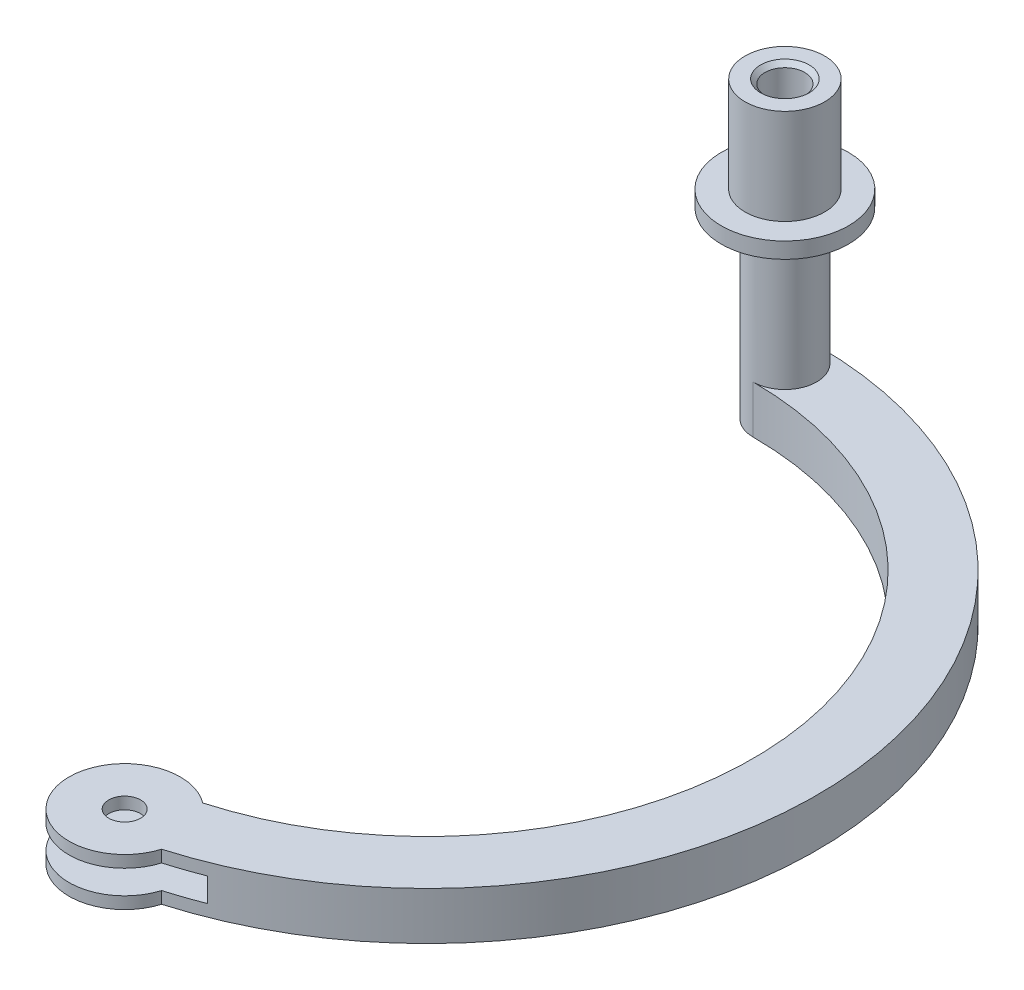
ISO-10303-21;
HEADER;
FILE_DESCRIPTION(('STEP AP214'),'2;1');
FILE_NAME('part.step','',(''),(''),'','','');
FILE_SCHEMA(('AUTOMOTIVE_DESIGN { 1 0 10303 214 1 1 1 1 }'));
ENDSEC;
DATA;
#1=APPLICATION_CONTEXT('core data for automotive mechanical design processes');
#2=APPLICATION_PROTOCOL_DEFINITION('international standard','automotive_design',2000,#1);
#3=PRODUCT_CONTEXT('',#1,'mechanical');
#4=PRODUCT('Part','Part','',(#3));
#5=PRODUCT_RELATED_PRODUCT_CATEGORY('part','',(#4));
#6=PRODUCT_DEFINITION_FORMATION('','',#4);
#7=PRODUCT_DEFINITION_CONTEXT('part definition',#1,'design');
#8=PRODUCT_DEFINITION('design','',#6,#7);
#9=PRODUCT_DEFINITION_SHAPE('','',#8);
#10=(LENGTH_UNIT() NAMED_UNIT(*) SI_UNIT(.MILLI.,.METRE.));
#11=(NAMED_UNIT(*) PLANE_ANGLE_UNIT() SI_UNIT($,.RADIAN.));
#12=(NAMED_UNIT(*) SI_UNIT($,.STERADIAN.) SOLID_ANGLE_UNIT());
#13=UNCERTAINTY_MEASURE_WITH_UNIT(LENGTH_MEASURE(1.E-05),#10,'distance_accuracy_value','');
#14=(GEOMETRIC_REPRESENTATION_CONTEXT(3) GLOBAL_UNCERTAINTY_ASSIGNED_CONTEXT((#13)) GLOBAL_UNIT_ASSIGNED_CONTEXT((#10,
#11,#12)) REPRESENTATION_CONTEXT('',''));
#15=CARTESIAN_POINT('',(0.,0.,0.));
#16=DIRECTION('',(0.,0.,1.));
#17=DIRECTION('',(1.,0.,0.));
#18=AXIS2_PLACEMENT_3D('',#15,#16,#17);
#19=CARTESIAN_POINT('',(0.,-12.5,22.5));
#20=DIRECTION('',(0.,1.,0.));
#21=DIRECTION('',(0.,0.,1.));
#22=AXIS2_PLACEMENT_3D('',#19,#20,#21);
#23=CYLINDRICAL_SURFACE('',#22,20.5);
#24=CARTESIAN_POINT('',(0.,-11.75,22.5));
#25=DIRECTION('',(0.,1.,0.));
#26=DIRECTION('',(0.,0.,1.));
#27=AXIS2_PLACEMENT_3D('',#24,#25,#26);
#28=CIRCLE('',#27,20.5);
#29=CARTESIAN_POINT('',(7.73125882983083,-11.75,41.4862486264708));
#30=VERTEX_POINT('',#29);
#31=CARTESIAN_POINT('',(5.61951395352331,-11.75,42.2147422738964));
#32=VERTEX_POINT('',#31);
#33=EDGE_CURVE('E155',#30,#32,#28,.F.);
#34=ORIENTED_EDGE('',*,*,#33,.F.);
#35=DIRECTION('',(0.,1.,0.));
#36=VECTOR('',#35,1.);
#37=CARTESIAN_POINT('',(7.73125882983082,-11.,41.4862486264708));
#38=LINE('',#37,#36);
#39=CARTESIAN_POINT('',(7.73125882983083,-10.25,41.4862486264708));
#40=VERTEX_POINT('',#39);
#41=EDGE_CURVE('E151',#30,#40,#38,.T.);
#42=ORIENTED_EDGE('',*,*,#41,.T.);
#43=CARTESIAN_POINT('',(0.,-10.25,22.5));
#44=DIRECTION('',(0.,1.,0.));
#45=DIRECTION('',(0.,0.,1.));
#46=AXIS2_PLACEMENT_3D('',#43,#44,#45);
#47=CIRCLE('',#46,20.5);
#48=CARTESIAN_POINT('',(5.61951395352331,-10.25,42.2147422738964));
#49=VERTEX_POINT('',#48);
#50=EDGE_CURVE('E150',#40,#49,#47,.F.);
#51=ORIENTED_EDGE('',*,*,#50,.T.);
#52=DIRECTION('',(0.,1.,0.));
#53=VECTOR('',#52,1.);
#54=CARTESIAN_POINT('',(5.61951395352331,-12.5,42.2147422738964));
#55=LINE('',#54,#53);
#56=CARTESIAN_POINT('',(5.61951395352331,-9.5,42.2147422738964));
#57=VERTEX_POINT('',#56);
#58=EDGE_CURVE('E166',#49,#57,#55,.T.);
#59=ORIENTED_EDGE('',*,*,#58,.T.);
#60=CARTESIAN_POINT('',(0.,-9.5,22.5));
#61=DIRECTION('',(0.,1.,0.));
#62=DIRECTION('',(0.,0.,-1.));
#63=AXIS2_PLACEMENT_3D('',#60,#61,#62);
#64=CIRCLE('',#63,20.5);
#65=CARTESIAN_POINT('',(0.,-9.5,2.));
#66=VERTEX_POINT('',#65);
#67=EDGE_CURVE('E160',#57,#66,#64,.T.);
#68=ORIENTED_EDGE('',*,*,#67,.T.);
#69=DIRECTION('',(0.,1.,0.));
#70=VECTOR('',#69,1.);
#71=CARTESIAN_POINT('',(0.,-12.5,2.));
#72=LINE('',#71,#70);
#73=CARTESIAN_POINT('',(0.,-12.5,2.));
#74=VERTEX_POINT('',#73);
#75=EDGE_CURVE('E187',#74,#66,#72,.T.);
#76=ORIENTED_EDGE('',*,*,#75,.F.);
#77=CARTESIAN_POINT('',(0.,-12.5,22.5));
#78=DIRECTION('',(0.,1.,0.));
#79=DIRECTION('',(0.,0.,-1.));
#80=AXIS2_PLACEMENT_3D('',#77,#78,#79);
#81=CIRCLE('',#80,20.5);
#82=CARTESIAN_POINT('',(5.61951395352331,-12.5,42.2147422738964));
#83=VERTEX_POINT('',#82);
#84=EDGE_CURVE('E156',#83,#74,#81,.T.);
#85=ORIENTED_EDGE('',*,*,#84,.F.);
#86=EDGE_CURVE('E176',#83,#32,#55,.T.);
#87=ORIENTED_EDGE('',*,*,#86,.T.);
#88=EDGE_LOOP('',(#34,#42,#51,#59,#68,#76,#85,#87));
#89=FACE_BOUND('',#88,.T.);
#90=ADVANCED_FACE('F44',(#89),#23,.F.);
#91=CARTESIAN_POINT('',(0.,-12.5,22.5));
#92=DIRECTION('',(0.,1.,0.));
#93=DIRECTION('',(0.,0.,1.));
#94=AXIS2_PLACEMENT_3D('',#91,#92,#93);
#95=CYLINDRICAL_SURFACE('',#94,24.5);
#96=CARTESIAN_POINT('',(0.,-11.75,22.5));
#97=DIRECTION('',(0.,1.,0.));
#98=DIRECTION('',(0.,0.,1.));
#99=AXIS2_PLACEMENT_3D('',#96,#97,#98);
#100=CIRCLE('',#99,24.5);
#101=CARTESIAN_POINT('',(6.84690974045204,-11.75,46.0238140403741));
#102=VERTEX_POINT('',#101);
#103=CARTESIAN_POINT('',(8.99234501725297,-11.75,45.2900796639829));
#104=VERTEX_POINT('',#103);
#105=EDGE_CURVE('E148',#102,#104,#100,.T.);
#106=ORIENTED_EDGE('',*,*,#105,.F.);
#107=DIRECTION('',(0.,1.,0.));
#108=VECTOR('',#107,1.);
#109=CARTESIAN_POINT('',(6.84690974045204,-12.5,46.0238140403741));
#110=LINE('',#109,#108);
#111=CARTESIAN_POINT('',(6.84690974045204,-12.5,46.0238140403741));
#112=VERTEX_POINT('',#111);
#113=EDGE_CURVE('E179',#112,#102,#110,.T.);
#114=ORIENTED_EDGE('',*,*,#113,.F.);
#115=CARTESIAN_POINT('',(0.,-12.5,22.5));
#116=DIRECTION('',(0.,-1.,0.));
#117=DIRECTION('',(0.,0.,1.));
#118=AXIS2_PLACEMENT_3D('',#115,#116,#117);
#119=CIRCLE('',#118,24.5);
#120=CARTESIAN_POINT('',(0.,-12.5,-2.));
#121=VERTEX_POINT('',#120);
#122=EDGE_CURVE('E165',#121,#112,#119,.T.);
#123=ORIENTED_EDGE('',*,*,#122,.F.);
#124=DIRECTION('',(0.,1.,0.));
#125=VECTOR('',#124,1.);
#126=CARTESIAN_POINT('',(0.,-12.5,-2.));
#127=LINE('',#126,#125);
#128=CARTESIAN_POINT('',(0.,-9.5,-2.));
#129=VERTEX_POINT('',#128);
#130=EDGE_CURVE('E182',#121,#129,#127,.T.);
#131=ORIENTED_EDGE('',*,*,#130,.T.);
#132=CARTESIAN_POINT('',(0.,-9.5,22.5));
#133=DIRECTION('',(0.,-1.,0.));
#134=DIRECTION('',(0.,0.,1.));
#135=AXIS2_PLACEMENT_3D('',#132,#133,#134);
#136=CIRCLE('',#135,24.5);
#137=CARTESIAN_POINT('',(6.84690974045204,-9.5,46.0238140403741));
#138=VERTEX_POINT('',#137);
#139=EDGE_CURVE('E171',#129,#138,#136,.T.);
#140=ORIENTED_EDGE('',*,*,#139,.T.);
#141=CARTESIAN_POINT('',(6.84690974045204,-10.25,46.0238140403741));
#142=VERTEX_POINT('',#141);
#143=EDGE_CURVE('E177',#142,#138,#110,.T.);
#144=ORIENTED_EDGE('',*,*,#143,.F.);
#145=CARTESIAN_POINT('',(0.,-10.25,22.5));
#146=DIRECTION('',(0.,1.,0.));
#147=DIRECTION('',(0.,0.,1.));
#148=AXIS2_PLACEMENT_3D('',#145,#146,#147);
#149=CIRCLE('',#148,24.5);
#150=CARTESIAN_POINT('',(8.99234501725297,-10.25,45.2900796639829));
#151=VERTEX_POINT('',#150);
#152=EDGE_CURVE('E62',#142,#151,#149,.T.);
#153=ORIENTED_EDGE('',*,*,#152,.T.);
#154=DIRECTION('',(0.,1.,0.));
#155=VECTOR('',#154,1.);
#156=CARTESIAN_POINT('',(8.99234501725297,-11.,45.2900796639829));
#157=LINE('',#156,#155);
#158=EDGE_CURVE('E11',#151,#104,#157,.F.);
#159=ORIENTED_EDGE('',*,*,#158,.T.);
#160=EDGE_LOOP('',(#106,#114,#123,#131,#140,#144,#153,#159));
#161=FACE_BOUND('',#160,.T.);
#162=ADVANCED_FACE('F217',(#161),#95,.T.);
#163=CARTESIAN_POINT('',(3.49999999999999,-12.5,45.));
#164=DIRECTION('',(0.,1.,0.));
#165=DIRECTION('',(0.,0.,1.));
#166=AXIS2_PLACEMENT_3D('',#163,#164,#165);
#167=CYLINDRICAL_SURFACE('',#166,3.5);
#168=CARTESIAN_POINT('',(3.49999999999999,-11.75,45.));
#169=DIRECTION('',(0.,1.,0.));
#170=DIRECTION('',(0.,0.,1.));
#171=AXIS2_PLACEMENT_3D('',#168,#169,#170);
#172=CIRCLE('',#171,3.5);
#173=EDGE_CURVE('E53',#32,#102,#172,.T.);
#174=ORIENTED_EDGE('',*,*,#173,.F.);
#175=ORIENTED_EDGE('',*,*,#86,.F.);
#176=CARTESIAN_POINT('',(3.49999999999999,-12.5,45.));
#177=DIRECTION('',(0.,-1.,0.));
#178=DIRECTION('',(0.,0.,1.));
#179=AXIS2_PLACEMENT_3D('',#176,#177,#178);
#180=CIRCLE('',#179,3.5);
#181=EDGE_CURVE('E168',#112,#83,#180,.T.);
#182=ORIENTED_EDGE('',*,*,#181,.F.);
#183=ORIENTED_EDGE('',*,*,#113,.T.);
#184=EDGE_LOOP('',(#174,#175,#182,#183));
#185=FACE_BOUND('',#184,.T.);
#186=ADVANCED_FACE('F216',(#185),#167,.T.);
#187=CARTESIAN_POINT('',(0.,6.,0.));
#188=DIRECTION('',(0.,-1.,0.));
#189=DIRECTION('',(0.,0.,-1.));
#190=AXIS2_PLACEMENT_3D('',#187,#188,#189);
#191=CYLINDRICAL_SURFACE('',#190,2.5);
#192=CARTESIAN_POINT('',(0.,6.,0.));
#193=DIRECTION('',(0.,1.,0.));
#194=DIRECTION('',(0.,0.,1.));
#195=AXIS2_PLACEMENT_3D('',#192,#193,#194);
#196=CIRCLE('',#195,2.5);
#197=CARTESIAN_POINT('',(0.,6.,2.5));
#198=VERTEX_POINT('',#197);
#199=EDGE_CURVE('E195',#198,#198,#196,.T.);
#200=ORIENTED_EDGE('',*,*,#199,.F.);
#201=EDGE_LOOP('',(#200));
#202=FACE_BOUND('',#201,.T.);
#203=CARTESIAN_POINT('',(0.,0.,0.));
#204=DIRECTION('',(0.,1.,0.));
#205=DIRECTION('',(0.,0.,1.));
#206=AXIS2_PLACEMENT_3D('',#203,#204,#205);
#207=CIRCLE('',#206,2.5);
#208=CARTESIAN_POINT('',(0.,0.,2.5));
#209=VERTEX_POINT('',#208);
#210=EDGE_CURVE('E199',#209,#209,#207,.T.);
#211=ORIENTED_EDGE('',*,*,#210,.T.);
#212=EDGE_LOOP('',(#211));
#213=FACE_BOUND('',#212,.T.);
#214=ADVANCED_FACE('F50',(#202,#213),#191,.T.);
#215=CARTESIAN_POINT('',(0.,6.,0.));
#216=DIRECTION('',(0.,1.,0.));
#217=DIRECTION('',(0.,0.,1.));
#218=AXIS2_PLACEMENT_3D('',#215,#216,#217);
#219=PLANE('',#218);
#220=CARTESIAN_POINT('',(0.,6.,0.));
#221=DIRECTION('',(0.,1.,0.));
#222=DIRECTION('',(0.,0.,1.));
#223=AXIS2_PLACEMENT_3D('',#220,#221,#222);
#224=CIRCLE('',#223,1.525);
#225=CARTESIAN_POINT('',(0.,6.,1.525));
#226=VERTEX_POINT('',#225);
#227=EDGE_CURVE('E132',#226,#226,#224,.T.);
#228=ORIENTED_EDGE('',*,*,#227,.F.);
#229=EDGE_LOOP('',(#228));
#230=FACE_BOUND('',#229,.T.);
#231=ORIENTED_EDGE('',*,*,#199,.T.);
#232=EDGE_LOOP('',(#231));
#233=FACE_BOUND('',#232,.T.);
#234=ADVANCED_FACE('F275',(#230,#233),#219,.T.);
#235=CARTESIAN_POINT('',(0.,-1.,0.));
#236=DIRECTION('',(0.,1.,0.));
#237=DIRECTION('',(0.,0.,1.));
#238=AXIS2_PLACEMENT_3D('',#235,#236,#237);
#239=CYLINDRICAL_SURFACE('',#238,4.);
#240=CARTESIAN_POINT('',(0.,-1.,0.));
#241=DIRECTION('',(0.,-1.,0.));
#242=DIRECTION('',(0.,0.,-1.));
#243=AXIS2_PLACEMENT_3D('',#240,#241,#242);
#244=CIRCLE('',#243,4.);
#245=CARTESIAN_POINT('',(0.,-1.,-4.));
#246=VERTEX_POINT('',#245);
#247=EDGE_CURVE('E193',#246,#246,#244,.T.);
#248=ORIENTED_EDGE('',*,*,#247,.F.);
#249=EDGE_LOOP('',(#248));
#250=FACE_BOUND('',#249,.T.);
#251=CARTESIAN_POINT('',(0.,0.,0.));
#252=DIRECTION('',(0.,-1.,0.));
#253=DIRECTION('',(0.,0.,-1.));
#254=AXIS2_PLACEMENT_3D('',#251,#252,#253);
#255=CIRCLE('',#254,4.);
#256=CARTESIAN_POINT('',(0.,0.,-4.));
#257=VERTEX_POINT('',#256);
#258=EDGE_CURVE('E191',#257,#257,#255,.T.);
#259=ORIENTED_EDGE('',*,*,#258,.T.);
#260=EDGE_LOOP('',(#259));
#261=FACE_BOUND('',#260,.T.);
#262=ADVANCED_FACE('F268',(#250,#261),#239,.T.);
#263=CARTESIAN_POINT('',(0.,-1.,0.));
#264=DIRECTION('',(0.,-1.,0.));
#265=DIRECTION('',(0.,0.,-1.));
#266=AXIS2_PLACEMENT_3D('',#263,#264,#265);
#267=PLANE('',#266);
#268=CARTESIAN_POINT('',(0.,-1.,0.));
#269=DIRECTION('',(0.,-1.,0.));
#270=DIRECTION('',(0.,0.,-1.));
#271=AXIS2_PLACEMENT_3D('',#268,#269,#270);
#272=CIRCLE('',#271,2.);
#273=CARTESIAN_POINT('',(0.,-1.,-2.));
#274=VERTEX_POINT('',#273);
#275=EDGE_CURVE('E189',#274,#274,#272,.T.);
#276=ORIENTED_EDGE('',*,*,#275,.F.);
#277=EDGE_LOOP('',(#276));
#278=FACE_BOUND('',#277,.T.);
#279=ORIENTED_EDGE('',*,*,#247,.T.);
#280=EDGE_LOOP('',(#279));
#281=FACE_BOUND('',#280,.T.);
#282=ADVANCED_FACE('F264',(#278,#281),#267,.T.);
#283=CARTESIAN_POINT('',(0.,0.,0.));
#284=DIRECTION('',(0.,-1.,0.));
#285=DIRECTION('',(0.,0.,-1.));
#286=AXIS2_PLACEMENT_3D('',#283,#284,#285);
#287=PLANE('',#286);
#288=ORIENTED_EDGE('',*,*,#210,.F.);
#289=EDGE_LOOP('',(#288));
#290=FACE_BOUND('',#289,.T.);
#291=ORIENTED_EDGE('',*,*,#258,.F.);
#292=EDGE_LOOP('',(#291));
#293=FACE_BOUND('',#292,.T.);
#294=ADVANCED_FACE('F262',(#290,#293),#287,.F.);
#295=CARTESIAN_POINT('',(0.,-15.1568542494924,0.));
#296=DIRECTION('',(0.,1.,0.));
#297=DIRECTION('',(0.,0.,1.));
#298=AXIS2_PLACEMENT_3D('',#295,#296,#297);
#299=CYLINDRICAL_SURFACE('',#298,2.);
#300=ORIENTED_EDGE('',*,*,#275,.T.);
#301=EDGE_LOOP('',(#300));
#302=FACE_BOUND('',#301,.T.);
#303=CARTESIAN_POINT('',(0.,-9.5,0.));
#304=DIRECTION('',(0.,-1.,0.));
#305=DIRECTION('',(0.,0.,-1.));
#306=AXIS2_PLACEMENT_3D('',#303,#304,#305);
#307=CIRCLE('',#306,2.);
#308=EDGE_CURVE('E66',#129,#66,#307,.T.);
#309=ORIENTED_EDGE('',*,*,#308,.F.);
#310=ORIENTED_EDGE('',*,*,#130,.F.);
#311=CARTESIAN_POINT('',(0.,-12.5,0.));
#312=DIRECTION('',(0.,-1.,0.));
#313=DIRECTION('',(0.,0.,1.));
#314=AXIS2_PLACEMENT_3D('',#311,#312,#313);
#315=CIRCLE('',#314,2.);
#316=EDGE_CURVE('E163',#74,#121,#315,.T.);
#317=ORIENTED_EDGE('',*,*,#316,.F.);
#318=ORIENTED_EDGE('',*,*,#75,.T.);
#319=EDGE_LOOP('',(#309,#310,#317,#318));
#320=FACE_BOUND('',#319,.T.);
#321=ADVANCED_FACE('F256',(#302,#320),#299,.T.);
#322=ORIENTED_EDGE('',*,*,#58,.F.);
#323=CARTESIAN_POINT('',(3.49999999999999,-10.25,45.));
#324=DIRECTION('',(0.,1.,0.));
#325=DIRECTION('',(0.,0.,1.));
#326=AXIS2_PLACEMENT_3D('',#323,#324,#325);
#327=CIRCLE('',#326,3.5);
#328=EDGE_CURVE('E192',#49,#142,#327,.T.);
#329=ORIENTED_EDGE('',*,*,#328,.T.);
#330=ORIENTED_EDGE('',*,*,#143,.T.);
#331=CARTESIAN_POINT('',(3.49999999999999,-9.5,45.));
#332=DIRECTION('',(0.,-1.,0.));
#333=DIRECTION('',(0.,0.,1.));
#334=AXIS2_PLACEMENT_3D('',#331,#332,#333);
#335=CIRCLE('',#334,3.5);
#336=EDGE_CURVE('E162',#138,#57,#335,.T.);
#337=ORIENTED_EDGE('',*,*,#336,.T.);
#338=EDGE_LOOP('',(#322,#329,#330,#337));
#339=FACE_BOUND('',#338,.T.);
#340=ADVANCED_FACE('F233',(#339),#167,.T.);
#341=CARTESIAN_POINT('',(1.75,-12.5,33.75));
#342=DIRECTION('',(0.,-1.,0.));
#343=DIRECTION('',(0.,0.,-1.));
#344=AXIS2_PLACEMENT_3D('',#341,#342,#343);
#345=PLANE('',#344);
#346=CARTESIAN_POINT('',(3.49999999999999,-12.5,45.));
#347=DIRECTION('',(0.,1.,0.));
#348=DIRECTION('',(0.,0.,1.));
#349=AXIS2_PLACEMENT_3D('',#346,#347,#348);
#350=CIRCLE('',#349,1.);
#351=CARTESIAN_POINT('',(3.49999999999999,-12.5,46.));
#352=VERTEX_POINT('',#351);
#353=EDGE_CURVE('E129',#352,#352,#350,.T.);
#354=ORIENTED_EDGE('',*,*,#353,.T.);
#355=EDGE_LOOP('',(#354));
#356=FACE_BOUND('',#355,.T.);
#357=ORIENTED_EDGE('',*,*,#84,.T.);
#358=ORIENTED_EDGE('',*,*,#316,.T.);
#359=ORIENTED_EDGE('',*,*,#122,.T.);
#360=ORIENTED_EDGE('',*,*,#181,.T.);
#361=EDGE_LOOP('',(#357,#358,#359,#360));
#362=FACE_BOUND('',#361,.T.);
#363=ADVANCED_FACE('F225',(#356,#362),#345,.T.);
#364=CARTESIAN_POINT('',(1.75,-9.5,33.75));
#365=DIRECTION('',(0.,-1.,0.));
#366=DIRECTION('',(0.,0.,-1.));
#367=AXIS2_PLACEMENT_3D('',#364,#365,#366);
#368=PLANE('',#367);
#369=CARTESIAN_POINT('',(3.49999999999999,-9.5,45.));
#370=DIRECTION('',(0.,1.,0.));
#371=DIRECTION('',(0.,0.,1.));
#372=AXIS2_PLACEMENT_3D('',#369,#370,#371);
#373=CIRCLE('',#372,1.);
#374=CARTESIAN_POINT('',(3.49999999999999,-9.5,46.));
#375=VERTEX_POINT('',#374);
#376=EDGE_CURVE('E121',#375,#375,#373,.T.);
#377=ORIENTED_EDGE('',*,*,#376,.F.);
#378=EDGE_LOOP('',(#377));
#379=FACE_BOUND('',#378,.T.);
#380=ORIENTED_EDGE('',*,*,#139,.F.);
#381=ORIENTED_EDGE('',*,*,#308,.T.);
#382=ORIENTED_EDGE('',*,*,#67,.F.);
#383=ORIENTED_EDGE('',*,*,#336,.F.);
#384=EDGE_LOOP('',(#380,#381,#382,#383));
#385=FACE_BOUND('',#384,.T.);
#386=ADVANCED_FACE('F226',(#379,#385),#368,.F.);
#387=CARTESIAN_POINT('',(3.49999999999999,-11.75,45.));
#388=DIRECTION('',(0.,1.,0.));
#389=DIRECTION('',(0.,0.,1.));
#390=AXIS2_PLACEMENT_3D('',#387,#388,#389);
#391=CYLINDRICAL_SURFACE('',#390,5.5);
#392=CARTESIAN_POINT('',(3.49999999999999,-11.75,45.));
#393=DIRECTION('',(0.,1.,0.));
#394=DIRECTION('',(0.,0.,1.));
#395=AXIS2_PLACEMENT_3D('',#392,#393,#394);
#396=CIRCLE('',#395,5.5);
#397=EDGE_CURVE('E142',#104,#30,#396,.T.);
#398=ORIENTED_EDGE('',*,*,#397,.F.);
#399=ORIENTED_EDGE('',*,*,#158,.F.);
#400=CARTESIAN_POINT('',(3.49999999999999,-10.25,45.));
#401=DIRECTION('',(0.,1.,0.));
#402=DIRECTION('',(0.,0.,1.));
#403=AXIS2_PLACEMENT_3D('',#400,#401,#402);
#404=CIRCLE('',#403,5.5);
#405=EDGE_CURVE('E137',#151,#40,#404,.T.);
#406=ORIENTED_EDGE('',*,*,#405,.T.);
#407=ORIENTED_EDGE('',*,*,#41,.F.);
#408=EDGE_LOOP('',(#398,#399,#406,#407));
#409=FACE_BOUND('',#408,.T.);
#410=ADVANCED_FACE('F232',(#409),#391,.F.);
#411=CARTESIAN_POINT('',(3.49999999999999,-11.75,45.));
#412=DIRECTION('',(0.,1.,0.));
#413=DIRECTION('',(0.,0.,1.));
#414=AXIS2_PLACEMENT_3D('',#411,#412,#413);
#415=PLANE('',#414);
#416=CARTESIAN_POINT('',(3.49999999999999,-11.75,45.));
#417=DIRECTION('',(0.,1.,0.));
#418=DIRECTION('',(0.,0.,1.));
#419=AXIS2_PLACEMENT_3D('',#416,#417,#418);
#420=CIRCLE('',#419,1.);
#421=CARTESIAN_POINT('',(3.49999999999999,-11.75,46.));
#422=VERTEX_POINT('',#421);
#423=EDGE_CURVE('E140',#422,#422,#420,.T.);
#424=ORIENTED_EDGE('',*,*,#423,.F.);
#425=EDGE_LOOP('',(#424));
#426=FACE_BOUND('',#425,.T.);
#427=ORIENTED_EDGE('',*,*,#33,.T.);
#428=ORIENTED_EDGE('',*,*,#173,.T.);
#429=ORIENTED_EDGE('',*,*,#105,.T.);
#430=ORIENTED_EDGE('',*,*,#397,.T.);
#431=EDGE_LOOP('',(#427,#428,#429,#430));
#432=FACE_BOUND('',#431,.T.);
#433=ADVANCED_FACE('F209',(#426,#432),#415,.T.);
#434=CARTESIAN_POINT('',(3.49999999999999,-10.25,45.));
#435=DIRECTION('',(0.,1.,0.));
#436=DIRECTION('',(0.,0.,1.));
#437=AXIS2_PLACEMENT_3D('',#434,#435,#436);
#438=PLANE('',#437);
#439=CARTESIAN_POINT('',(3.49999999999999,-10.25,45.));
#440=DIRECTION('',(0.,1.,0.));
#441=DIRECTION('',(0.,0.,1.));
#442=AXIS2_PLACEMENT_3D('',#439,#440,#441);
#443=CIRCLE('',#442,1.);
#444=CARTESIAN_POINT('',(3.49999999999999,-10.25,46.));
#445=VERTEX_POINT('',#444);
#446=EDGE_CURVE('E47',#445,#445,#443,.T.);
#447=ORIENTED_EDGE('',*,*,#446,.T.);
#448=EDGE_LOOP('',(#447));
#449=FACE_BOUND('',#448,.T.);
#450=ORIENTED_EDGE('',*,*,#405,.F.);
#451=ORIENTED_EDGE('',*,*,#152,.F.);
#452=ORIENTED_EDGE('',*,*,#328,.F.);
#453=ORIENTED_EDGE('',*,*,#50,.F.);
#454=EDGE_LOOP('',(#450,#451,#452,#453));
#455=FACE_BOUND('',#454,.T.);
#456=ADVANCED_FACE('F235',(#449,#455),#438,.F.);
#457=CARTESIAN_POINT('',(3.49999999999999,-12.5,45.));
#458=DIRECTION('',(0.,1.,0.));
#459=DIRECTION('',(0.,0.,1.));
#460=AXIS2_PLACEMENT_3D('',#457,#458,#459);
#461=CYLINDRICAL_SURFACE('',#460,1.);
#462=ORIENTED_EDGE('',*,*,#376,.T.);
#463=EDGE_LOOP('',(#462));
#464=FACE_BOUND('',#463,.T.);
#465=ORIENTED_EDGE('',*,*,#446,.F.);
#466=EDGE_LOOP('',(#465));
#467=FACE_BOUND('',#466,.T.);
#468=ADVANCED_FACE('F305',(#464,#467),#461,.F.);
#469=ORIENTED_EDGE('',*,*,#423,.T.);
#470=EDGE_LOOP('',(#469));
#471=FACE_BOUND('',#470,.T.);
#472=ORIENTED_EDGE('',*,*,#353,.F.);
#473=EDGE_LOOP('',(#472));
#474=FACE_BOUND('',#473,.T.);
#475=ADVANCED_FACE('F117',(#471,#474),#461,.F.);
#476=CARTESIAN_POINT('',(0.,-1.49999999999999,0.));
#477=DIRECTION('',(0.,1.,0.));
#478=DIRECTION('',(0.,0.,1.));
#479=AXIS2_PLACEMENT_3D('',#476,#477,#478);
#480=CONICAL_SURFACE('',#479,1.24999999999999,1.02974425867664);
#481=CARTESIAN_POINT('',(0.,-2.25107577378445,0.));
#482=VERTEX_POINT('',#481);
#483=VERTEX_LOOP('',#482);
#484=FACE_BOUND('',#483,.T.);
#485=CARTESIAN_POINT('',(0.,-1.49999999999999,0.));
#486=DIRECTION('',(0.,1.,0.));
#487=DIRECTION('',(0.,0.,1.));
#488=AXIS2_PLACEMENT_3D('',#485,#486,#487);
#489=CIRCLE('',#488,1.24999999999999);
#490=CARTESIAN_POINT('',(0.,-1.49999999999999,1.24999999999999));
#491=VERTEX_POINT('',#490);
#492=EDGE_CURVE('E125',#491,#491,#489,.T.);
#493=ORIENTED_EDGE('',*,*,#492,.T.);
#494=EDGE_LOOP('',(#493));
#495=FACE_BOUND('',#494,.T.);
#496=ADVANCED_FACE('F112',(#484,#495),#480,.F.);
#497=CARTESIAN_POINT('',(0.,6.,0.));
#498=DIRECTION('',(0.,1.,0.));
#499=DIRECTION('',(0.,0.,1.));
#500=AXIS2_PLACEMENT_3D('',#497,#498,#499);
#501=CYLINDRICAL_SURFACE('',#500,1.24999999999999);
#502=ORIENTED_EDGE('',*,*,#492,.F.);
#503=EDGE_LOOP('',(#502));
#504=FACE_BOUND('',#503,.T.);
#505=CARTESIAN_POINT('',(0.,5.725,0.));
#506=DIRECTION('',(0.,1.,0.));
#507=DIRECTION('',(0.,0.,1.));
#508=AXIS2_PLACEMENT_3D('',#505,#506,#507);
#509=CIRCLE('',#508,1.24999999999999);
#510=CARTESIAN_POINT('',(0.,5.725,1.24999999999999));
#511=VERTEX_POINT('',#510);
#512=EDGE_CURVE('E123',#511,#511,#509,.T.);
#513=ORIENTED_EDGE('',*,*,#512,.T.);
#514=EDGE_LOOP('',(#513));
#515=FACE_BOUND('',#514,.T.);
#516=ADVANCED_FACE('F120',(#504,#515),#501,.F.);
#517=CARTESIAN_POINT('',(0.,6.,0.));
#518=DIRECTION('',(0.,1.,0.));
#519=DIRECTION('',(0.,0.,1.));
#520=AXIS2_PLACEMENT_3D('',#517,#518,#519);
#521=CONICAL_SURFACE('',#520,1.525,0.78539816339747);
#522=ORIENTED_EDGE('',*,*,#512,.F.);
#523=EDGE_LOOP('',(#522));
#524=FACE_BOUND('',#523,.T.);
#525=ORIENTED_EDGE('',*,*,#227,.T.);
#526=EDGE_LOOP('',(#525));
#527=FACE_BOUND('',#526,.T.);
#528=ADVANCED_FACE('F293',(#524,#527),#521,.F.);
#529=CLOSED_SHELL('',(#90,#162,#186,#214,#234,#262,#282,#294,#321,#340,#363,#386,#410,#433,#456,
#468,#475,#496,#516,#528));
#530=MANIFOLD_SOLID_BREP('B2',#529);
#531=ADVANCED_BREP_SHAPE_REPRESENTATION('',(#18,#530),#14);
#532=SHAPE_DEFINITION_REPRESENTATION(#9,#531);
ENDSEC;
END-ISO-10303-21;
